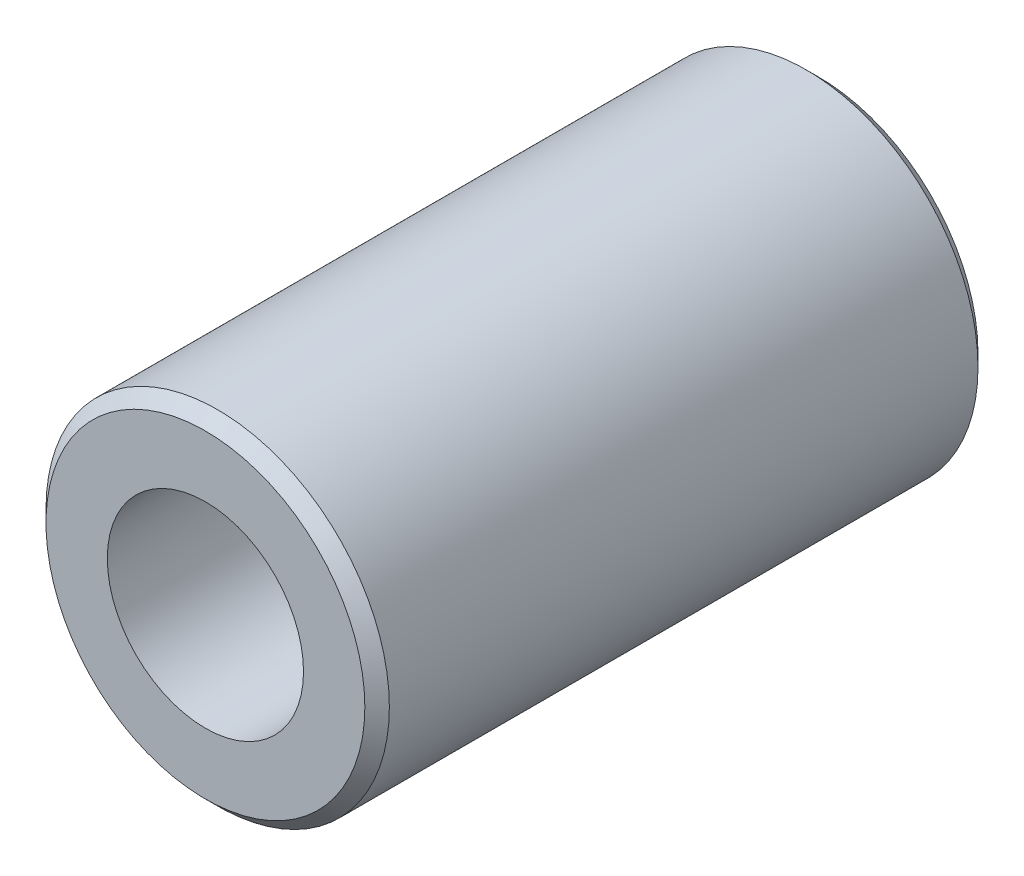
ISO-10303-21;
HEADER;
FILE_DESCRIPTION(('STEP AP214'),'2;1');
FILE_NAME('part.step','',(''),(''),'','','');
FILE_SCHEMA(('AUTOMOTIVE_DESIGN { 1 0 10303 214 1 1 1 1 }'));
ENDSEC;
DATA;
#1=APPLICATION_CONTEXT('core data for automotive mechanical design processes');
#2=APPLICATION_PROTOCOL_DEFINITION('international standard','automotive_design',2000,#1);
#3=PRODUCT_CONTEXT('',#1,'mechanical');
#4=PRODUCT('Part','Part','',(#3));
#5=PRODUCT_RELATED_PRODUCT_CATEGORY('part','',(#4));
#6=PRODUCT_DEFINITION_FORMATION('','',#4);
#7=PRODUCT_DEFINITION_CONTEXT('part definition',#1,'design');
#8=PRODUCT_DEFINITION('design','',#6,#7);
#9=PRODUCT_DEFINITION_SHAPE('','',#8);
#10=(LENGTH_UNIT() NAMED_UNIT(*) SI_UNIT(.MILLI.,.METRE.));
#11=(NAMED_UNIT(*) PLANE_ANGLE_UNIT() SI_UNIT($,.RADIAN.));
#12=(NAMED_UNIT(*) SI_UNIT($,.STERADIAN.) SOLID_ANGLE_UNIT());
#13=UNCERTAINTY_MEASURE_WITH_UNIT(LENGTH_MEASURE(1.E-05),#10,'distance_accuracy_value','');
#14=(GEOMETRIC_REPRESENTATION_CONTEXT(3) GLOBAL_UNCERTAINTY_ASSIGNED_CONTEXT((#13)) GLOBAL_UNIT_ASSIGNED_CONTEXT((#10,
#11,#12)) REPRESENTATION_CONTEXT('',''));
#15=CARTESIAN_POINT('',(0.,0.,0.));
#16=DIRECTION('',(0.,0.,1.));
#17=DIRECTION('',(1.,0.,0.));
#18=AXIS2_PLACEMENT_3D('',#15,#16,#17);
#19=CARTESIAN_POINT('',(0.,0.,25.));
#20=DIRECTION('',(0.,0.,-1.));
#21=DIRECTION('',(-1.,0.,0.));
#22=AXIS2_PLACEMENT_3D('',#19,#20,#21);
#23=CYLINDRICAL_SURFACE('',#22,7.);
#24=CARTESIAN_POINT('',(0.,0.,0.500000000000007));
#25=DIRECTION('',(0.,0.,1.));
#26=DIRECTION('',(1.,0.,0.));
#27=AXIS2_PLACEMENT_3D('',#24,#25,#26);
#28=CIRCLE('',#27,7.);
#29=CARTESIAN_POINT('',(7.,0.,0.500000000000007));
#30=VERTEX_POINT('',#29);
#31=EDGE_CURVE('E44',#30,#30,#28,.T.);
#32=ORIENTED_EDGE('',*,*,#31,.T.);
#33=EDGE_LOOP('',(#32));
#34=FACE_BOUND('',#33,.T.);
#35=CARTESIAN_POINT('',(0.,0.,24.5));
#36=DIRECTION('',(0.,0.,1.));
#37=DIRECTION('',(1.,0.,0.));
#38=AXIS2_PLACEMENT_3D('',#35,#36,#37);
#39=CIRCLE('',#38,7.);
#40=CARTESIAN_POINT('',(7.,0.,24.5));
#41=VERTEX_POINT('',#40);
#42=EDGE_CURVE('E48',#41,#41,#39,.F.);
#43=ORIENTED_EDGE('',*,*,#42,.T.);
#44=EDGE_LOOP('',(#43));
#45=FACE_BOUND('',#44,.T.);
#46=ADVANCED_FACE('F32',(#34,#45),#23,.T.);
#47=CARTESIAN_POINT('',(0.,0.,25.));
#48=DIRECTION('',(0.,0.,1.));
#49=DIRECTION('',(1.,0.,0.));
#50=AXIS2_PLACEMENT_3D('',#47,#48,#49);
#51=PLANE('',#50);
#52=CARTESIAN_POINT('',(0.,0.,25.));
#53=DIRECTION('',(0.,0.,1.));
#54=DIRECTION('',(1.,0.,0.));
#55=AXIS2_PLACEMENT_3D('',#52,#53,#54);
#56=CIRCLE('',#55,6.5);
#57=CARTESIAN_POINT('',(6.5,0.,25.));
#58=VERTEX_POINT('',#57);
#59=EDGE_CURVE('E10',#58,#58,#56,.T.);
#60=ORIENTED_EDGE('',*,*,#59,.T.);
#61=EDGE_LOOP('',(#60));
#62=FACE_BOUND('',#61,.T.);
#63=CARTESIAN_POINT('',(0.,0.,25.));
#64=DIRECTION('',(0.,0.,1.));
#65=DIRECTION('',(1.,0.,0.));
#66=AXIS2_PLACEMENT_3D('',#63,#64,#65);
#67=CIRCLE('',#66,4.);
#68=CARTESIAN_POINT('',(4.,0.,25.));
#69=VERTEX_POINT('',#68);
#70=EDGE_CURVE('E57',#69,#69,#67,.T.);
#71=ORIENTED_EDGE('',*,*,#70,.F.);
#72=EDGE_LOOP('',(#71));
#73=FACE_BOUND('',#72,.T.);
#74=ADVANCED_FACE('F82',(#62,#73),#51,.T.);
#75=CARTESIAN_POINT('',(0.,0.,0.));
#76=DIRECTION('',(0.,0.,1.));
#77=DIRECTION('',(1.,0.,0.));
#78=AXIS2_PLACEMENT_3D('',#75,#76,#77);
#79=PLANE('',#78);
#80=CARTESIAN_POINT('',(0.,0.,0.));
#81=DIRECTION('',(0.,0.,1.));
#82=DIRECTION('',(1.,0.,0.));
#83=AXIS2_PLACEMENT_3D('',#80,#81,#82);
#84=CIRCLE('',#83,6.49999999999999);
#85=CARTESIAN_POINT('',(6.49999999999999,0.,0.));
#86=VERTEX_POINT('',#85);
#87=EDGE_CURVE('E40',#86,#86,#84,.F.);
#88=ORIENTED_EDGE('',*,*,#87,.T.);
#89=EDGE_LOOP('',(#88));
#90=FACE_BOUND('',#89,.T.);
#91=CARTESIAN_POINT('',(0.,0.,0.));
#92=DIRECTION('',(0.,0.,1.));
#93=DIRECTION('',(1.,0.,0.));
#94=AXIS2_PLACEMENT_3D('',#91,#92,#93);
#95=CIRCLE('',#94,2.5);
#96=CARTESIAN_POINT('',(2.5,0.,0.));
#97=VERTEX_POINT('',#96);
#98=EDGE_CURVE('E54',#97,#97,#95,.T.);
#99=ORIENTED_EDGE('',*,*,#98,.T.);
#100=EDGE_LOOP('',(#99));
#101=FACE_BOUND('',#100,.T.);
#102=ADVANCED_FACE('F78',(#90,#101),#79,.F.);
#103=CARTESIAN_POINT('',(0.,0.,12.5));
#104=DIRECTION('',(0.,0.,1.));
#105=DIRECTION('',(1.,0.,0.));
#106=AXIS2_PLACEMENT_3D('',#103,#104,#105);
#107=CYLINDRICAL_SURFACE('',#106,4.);
#108=CARTESIAN_POINT('',(0.,0.,12.5));
#109=DIRECTION('',(0.,0.,1.));
#110=DIRECTION('',(1.,0.,0.));
#111=AXIS2_PLACEMENT_3D('',#108,#109,#110);
#112=CIRCLE('',#111,4.);
#113=CARTESIAN_POINT('',(4.,0.,12.5));
#114=VERTEX_POINT('',#113);
#115=EDGE_CURVE('E53',#114,#114,#112,.T.);
#116=ORIENTED_EDGE('',*,*,#115,.F.);
#117=EDGE_LOOP('',(#116));
#118=FACE_BOUND('',#117,.T.);
#119=ORIENTED_EDGE('',*,*,#70,.T.);
#120=EDGE_LOOP('',(#119));
#121=FACE_BOUND('',#120,.T.);
#122=ADVANCED_FACE('F72',(#118,#121),#107,.F.);
#123=CARTESIAN_POINT('',(0.,0.,12.5));
#124=DIRECTION('',(0.,0.,1.));
#125=DIRECTION('',(1.,0.,0.));
#126=AXIS2_PLACEMENT_3D('',#123,#124,#125);
#127=PLANE('',#126);
#128=CARTESIAN_POINT('',(0.,0.,12.5));
#129=DIRECTION('',(0.,0.,1.));
#130=DIRECTION('',(1.,0.,0.));
#131=AXIS2_PLACEMENT_3D('',#128,#129,#130);
#132=CIRCLE('',#131,2.5);
#133=CARTESIAN_POINT('',(2.5,0.,12.5));
#134=VERTEX_POINT('',#133);
#135=EDGE_CURVE('E58',#134,#134,#132,.T.);
#136=ORIENTED_EDGE('',*,*,#135,.F.);
#137=EDGE_LOOP('',(#136));
#138=FACE_BOUND('',#137,.T.);
#139=ORIENTED_EDGE('',*,*,#115,.T.);
#140=EDGE_LOOP('',(#139));
#141=FACE_BOUND('',#140,.T.);
#142=ADVANCED_FACE('F69',(#138,#141),#127,.T.);
#143=CARTESIAN_POINT('',(0.,0.,-2.));
#144=DIRECTION('',(0.,0.,1.));
#145=DIRECTION('',(1.,0.,0.));
#146=AXIS2_PLACEMENT_3D('',#143,#144,#145);
#147=CYLINDRICAL_SURFACE('',#146,2.5);
#148=ORIENTED_EDGE('',*,*,#135,.T.);
#149=EDGE_LOOP('',(#148));
#150=FACE_BOUND('',#149,.T.);
#151=ORIENTED_EDGE('',*,*,#98,.F.);
#152=EDGE_LOOP('',(#151));
#153=FACE_BOUND('',#152,.T.);
#154=ADVANCED_FACE('F66',(#150,#153),#147,.F.);
#155=CARTESIAN_POINT('',(0.,0.,0.500000000000007));
#156=DIRECTION('',(0.,0.,1.));
#157=DIRECTION('',(1.,0.,0.));
#158=AXIS2_PLACEMENT_3D('',#155,#156,#157);
#159=CONICAL_SURFACE('',#158,7.,0.785398163397447);
#160=ORIENTED_EDGE('',*,*,#87,.F.);
#161=EDGE_LOOP('',(#160));
#162=FACE_BOUND('',#161,.T.);
#163=ORIENTED_EDGE('',*,*,#31,.F.);
#164=EDGE_LOOP('',(#163));
#165=FACE_BOUND('',#164,.T.);
#166=ADVANCED_FACE('F93',(#162,#165),#159,.T.);
#167=CARTESIAN_POINT('',(0.,0.,25.));
#168=DIRECTION('',(0.,0.,-1.));
#169=DIRECTION('',(-1.,0.,0.));
#170=AXIS2_PLACEMENT_3D('',#167,#168,#169);
#171=CONICAL_SURFACE('',#170,6.5,0.785398163397452);
#172=ORIENTED_EDGE('',*,*,#42,.F.);
#173=EDGE_LOOP('',(#172));
#174=FACE_BOUND('',#173,.T.);
#175=ORIENTED_EDGE('',*,*,#59,.F.);
#176=EDGE_LOOP('',(#175));
#177=FACE_BOUND('',#176,.T.);
#178=ADVANCED_FACE('F35',(#174,#177),#171,.T.);
#179=CLOSED_SHELL('',(#46,#74,#102,#122,#142,#154,#166,#178));
#180=MANIFOLD_SOLID_BREP('B2',#179);
#181=ADVANCED_BREP_SHAPE_REPRESENTATION('',(#18,#180),#14);
#182=SHAPE_DEFINITION_REPRESENTATION(#9,#181);
ENDSEC;
END-ISO-10303-21;
